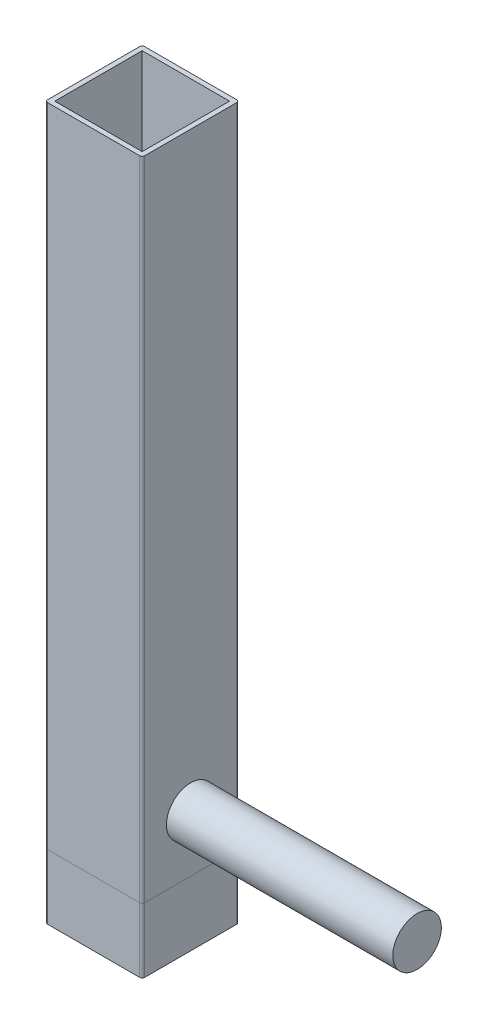
ISO-10303-21;
HEADER;
FILE_DESCRIPTION(('STEP AP214'),'2;1');
FILE_NAME('part.step','',(''),(''),'','','');
FILE_SCHEMA(('AUTOMOTIVE_DESIGN { 1 0 10303 214 1 1 1 1 }'));
ENDSEC;
DATA;
#1=APPLICATION_CONTEXT('core data for automotive mechanical design processes');
#2=APPLICATION_PROTOCOL_DEFINITION('international standard','automotive_design',2000,#1);
#3=PRODUCT_CONTEXT('',#1,'mechanical');
#4=PRODUCT('Part','Part','',(#3));
#5=PRODUCT_RELATED_PRODUCT_CATEGORY('part','',(#4));
#6=PRODUCT_DEFINITION_FORMATION('','',#4);
#7=PRODUCT_DEFINITION_CONTEXT('part definition',#1,'design');
#8=PRODUCT_DEFINITION('design','',#6,#7);
#9=PRODUCT_DEFINITION_SHAPE('','',#8);
#10=(LENGTH_UNIT() NAMED_UNIT(*) SI_UNIT(.MILLI.,.METRE.));
#11=(NAMED_UNIT(*) PLANE_ANGLE_UNIT() SI_UNIT($,.RADIAN.));
#12=(NAMED_UNIT(*) SI_UNIT($,.STERADIAN.) SOLID_ANGLE_UNIT());
#13=UNCERTAINTY_MEASURE_WITH_UNIT(LENGTH_MEASURE(1.E-05),#10,'distance_accuracy_value','');
#14=(GEOMETRIC_REPRESENTATION_CONTEXT(3) GLOBAL_UNCERTAINTY_ASSIGNED_CONTEXT((#13)) GLOBAL_UNIT_ASSIGNED_CONTEXT((#10,
#11,#12)) REPRESENTATION_CONTEXT('',''));
#15=CARTESIAN_POINT('',(0.,0.,0.));
#16=DIRECTION('',(0.,0.,1.));
#17=DIRECTION('',(1.,0.,0.));
#18=AXIS2_PLACEMENT_3D('',#15,#16,#17);
#19=CARTESIAN_POINT('',(107.95,22.225,0.));
#20=DIRECTION('',(-1.,0.,0.));
#21=DIRECTION('',(0.,0.,1.));
#22=AXIS2_PLACEMENT_3D('',#19,#20,#21);
#23=CYLINDRICAL_SURFACE('',#22,9.525);
#24=CARTESIAN_POINT('',(107.95,22.225,0.));
#25=DIRECTION('',(1.,0.,0.));
#26=DIRECTION('',(0.,0.,-1.));
#27=AXIS2_PLACEMENT_3D('',#24,#25,#26);
#28=CIRCLE('',#27,9.525);
#29=CARTESIAN_POINT('',(107.95,22.225,-9.525));
#30=VERTEX_POINT('',#29);
#31=EDGE_CURVE('E12',#30,#30,#28,.T.);
#32=ORIENTED_EDGE('',*,*,#31,.F.);
#33=EDGE_LOOP('',(#32));
#34=FACE_BOUND('',#33,.T.);
#35=CARTESIAN_POINT('',(19.05,22.225,0.));
#36=DIRECTION('',(1.,0.,0.));
#37=DIRECTION('',(0.,0.,-1.));
#38=AXIS2_PLACEMENT_3D('',#35,#36,#37);
#39=CIRCLE('',#38,9.525);
#40=CARTESIAN_POINT('',(19.05,22.225,-9.525));
#41=VERTEX_POINT('',#40);
#42=EDGE_CURVE('E74',#41,#41,#39,.T.);
#43=ORIENTED_EDGE('',*,*,#42,.T.);
#44=EDGE_LOOP('',(#43));
#45=FACE_BOUND('',#44,.T.);
#46=ADVANCED_FACE('F71',(#34,#45),#23,.T.);
#47=CARTESIAN_POINT('',(107.95,22.225,0.));
#48=DIRECTION('',(1.,0.,0.));
#49=DIRECTION('',(0.,0.,-1.));
#50=AXIS2_PLACEMENT_3D('',#47,#48,#49);
#51=PLANE('',#50);
#52=ORIENTED_EDGE('',*,*,#31,.T.);
#53=EDGE_LOOP('',(#52));
#54=FACE_BOUND('',#53,.T.);
#55=ADVANCED_FACE('F86',(#54),#51,.T.);
#56=CARTESIAN_POINT('',(19.05,22.225,0.));
#57=DIRECTION('',(1.,0.,0.));
#58=DIRECTION('',(0.,0.,-1.));
#59=AXIS2_PLACEMENT_3D('',#56,#57,#58);
#60=PLANE('',#59);
#61=ORIENTED_EDGE('',*,*,#42,.F.);
#62=EDGE_LOOP('',(#61));
#63=FACE_BOUND('',#62,.T.);
#64=ADVANCED_FACE('F84',(#63),#60,.F.);
#65=CLOSED_SHELL('',(#46,#55,#64));
#66=MANIFOLD_SOLID_BREP('B2',#65);
#67=CARTESIAN_POINT('',(19.05,0.,-18.05));
#68=DIRECTION('',(-1.,0.,0.));
#69=DIRECTION('',(0.,-1.,0.));
#70=AXIS2_PLACEMENT_3D('',#67,#68,#69);
#71=PLANE('',#70);
#72=DIRECTION('',(0.,0.,1.));
#73=VECTOR('',#72,1.);
#74=CARTESIAN_POINT('',(19.05,0.,-18.05));
#75=LINE('',#74,#73);
#76=CARTESIAN_POINT('',(19.05,0.,-18.05));
#77=VERTEX_POINT('',#76);
#78=CARTESIAN_POINT('',(19.05,0.,18.05));
#79=VERTEX_POINT('',#78);
#80=EDGE_CURVE('E219',#77,#79,#75,.T.);
#81=ORIENTED_EDGE('',*,*,#80,.F.);
#82=DIRECTION('',(0.,1.,0.));
#83=VECTOR('',#82,1.);
#84=CARTESIAN_POINT('',(19.05,0.,-18.05));
#85=LINE('',#84,#83);
#86=CARTESIAN_POINT('',(19.05,254.,-18.05));
#87=VERTEX_POINT('',#86);
#88=EDGE_CURVE('E135',#77,#87,#85,.T.);
#89=ORIENTED_EDGE('',*,*,#88,.T.);
#90=DIRECTION('',(0.,0.,1.));
#91=VECTOR('',#90,1.);
#92=CARTESIAN_POINT('',(19.05,254.,-18.05));
#93=LINE('',#92,#91);
#94=CARTESIAN_POINT('',(19.05,254.,18.05));
#95=VERTEX_POINT('',#94);
#96=EDGE_CURVE('E287',#87,#95,#93,.T.);
#97=ORIENTED_EDGE('',*,*,#96,.T.);
#98=DIRECTION('',(0.,1.,0.));
#99=VECTOR('',#98,1.);
#100=CARTESIAN_POINT('',(19.05,0.,18.05));
#101=LINE('',#100,#99);
#102=EDGE_CURVE('E237',#79,#95,#101,.T.);
#103=ORIENTED_EDGE('',*,*,#102,.F.);
#104=EDGE_LOOP('',(#81,#89,#97,#103));
#105=FACE_BOUND('',#104,.T.);
#106=ADVANCED_FACE('F120',(#105),#71,.F.);
#107=CARTESIAN_POINT('',(18.05,0.,-18.05));
#108=DIRECTION('',(0.,1.,0.));
#109=DIRECTION('',(-1.,0.,0.));
#110=AXIS2_PLACEMENT_3D('',#107,#108,#109);
#111=CYLINDRICAL_SURFACE('',#110,1.);
#112=CARTESIAN_POINT('',(18.05,0.,-18.05));
#113=DIRECTION('',(0.,-1.,0.));
#114=DIRECTION('',(1.,0.,0.));
#115=AXIS2_PLACEMENT_3D('',#112,#113,#114);
#116=CIRCLE('',#115,1.);
#117=CARTESIAN_POINT('',(18.05,0.,-19.05));
#118=VERTEX_POINT('',#117);
#119=EDGE_CURVE('E306',#118,#77,#116,.T.);
#120=ORIENTED_EDGE('',*,*,#119,.F.);
#121=DIRECTION('',(0.,1.,0.));
#122=VECTOR('',#121,1.);
#123=CARTESIAN_POINT('',(18.05,0.,-19.05));
#124=LINE('',#123,#122);
#125=CARTESIAN_POINT('',(18.05,254.,-19.05));
#126=VERTEX_POINT('',#125);
#127=EDGE_CURVE('E240',#118,#126,#124,.T.);
#128=ORIENTED_EDGE('',*,*,#127,.T.);
#129=CARTESIAN_POINT('',(18.05,254.,-18.05));
#130=DIRECTION('',(0.,-1.,0.));
#131=DIRECTION('',(1.,0.,0.));
#132=AXIS2_PLACEMENT_3D('',#129,#130,#131);
#133=CIRCLE('',#132,1.);
#134=EDGE_CURVE('E285',#126,#87,#133,.T.);
#135=ORIENTED_EDGE('',*,*,#134,.T.);
#136=ORIENTED_EDGE('',*,*,#88,.F.);
#137=EDGE_LOOP('',(#120,#128,#135,#136));
#138=FACE_BOUND('',#137,.T.);
#139=ADVANCED_FACE('F329',(#138),#111,.T.);
#140=CARTESIAN_POINT('',(-18.05,0.,-19.05));
#141=DIRECTION('',(0.,0.,1.));
#142=DIRECTION('',(1.,0.,0.));
#143=AXIS2_PLACEMENT_3D('',#140,#141,#142);
#144=PLANE('',#143);
#145=DIRECTION('',(1.,0.,0.));
#146=VECTOR('',#145,1.);
#147=CARTESIAN_POINT('',(-18.05,0.,-19.05));
#148=LINE('',#147,#146);
#149=CARTESIAN_POINT('',(-18.05,0.,-19.05));
#150=VERTEX_POINT('',#149);
#151=EDGE_CURVE('E309',#150,#118,#148,.T.);
#152=ORIENTED_EDGE('',*,*,#151,.F.);
#153=DIRECTION('',(0.,1.,0.));
#154=VECTOR('',#153,1.);
#155=CARTESIAN_POINT('',(-18.05,0.,-19.05));
#156=LINE('',#155,#154);
#157=CARTESIAN_POINT('',(-18.05,254.,-19.05));
#158=VERTEX_POINT('',#157);
#159=EDGE_CURVE('E242',#150,#158,#156,.T.);
#160=ORIENTED_EDGE('',*,*,#159,.T.);
#161=DIRECTION('',(1.,0.,0.));
#162=VECTOR('',#161,1.);
#163=CARTESIAN_POINT('',(-18.05,254.,-19.05));
#164=LINE('',#163,#162);
#165=EDGE_CURVE('E282',#158,#126,#164,.T.);
#166=ORIENTED_EDGE('',*,*,#165,.T.);
#167=ORIENTED_EDGE('',*,*,#127,.F.);
#168=EDGE_LOOP('',(#152,#160,#166,#167));
#169=FACE_BOUND('',#168,.T.);
#170=ADVANCED_FACE('F332',(#169),#144,.F.);
#171=CARTESIAN_POINT('',(-18.05,0.,-18.05));
#172=DIRECTION('',(0.,1.,0.));
#173=DIRECTION('',(-1.,0.,0.));
#174=AXIS2_PLACEMENT_3D('',#171,#172,#173);
#175=CYLINDRICAL_SURFACE('',#174,1.);
#176=CARTESIAN_POINT('',(-18.05,0.,-18.05));
#177=DIRECTION('',(0.,-1.,0.));
#178=DIRECTION('',(1.,0.,0.));
#179=AXIS2_PLACEMENT_3D('',#176,#177,#178);
#180=CIRCLE('',#179,1.);
#181=CARTESIAN_POINT('',(-19.05,0.,-18.05));
#182=VERTEX_POINT('',#181);
#183=EDGE_CURVE('E312',#182,#150,#180,.T.);
#184=ORIENTED_EDGE('',*,*,#183,.F.);
#185=DIRECTION('',(0.,1.,0.));
#186=VECTOR('',#185,1.);
#187=CARTESIAN_POINT('',(-19.05,0.,-18.05));
#188=LINE('',#187,#186);
#189=CARTESIAN_POINT('',(-19.05,254.,-18.05));
#190=VERTEX_POINT('',#189);
#191=EDGE_CURVE('E244',#182,#190,#188,.T.);
#192=ORIENTED_EDGE('',*,*,#191,.T.);
#193=CARTESIAN_POINT('',(-18.05,254.,-18.05));
#194=DIRECTION('',(0.,-1.,0.));
#195=DIRECTION('',(-1.,0.,0.));
#196=AXIS2_PLACEMENT_3D('',#193,#194,#195);
#197=CIRCLE('',#196,1.);
#198=EDGE_CURVE('E276',#190,#158,#197,.T.);
#199=ORIENTED_EDGE('',*,*,#198,.T.);
#200=ORIENTED_EDGE('',*,*,#159,.F.);
#201=EDGE_LOOP('',(#184,#192,#199,#200));
#202=FACE_BOUND('',#201,.T.);
#203=ADVANCED_FACE('F335',(#202),#175,.T.);
#204=CARTESIAN_POINT('',(-19.05,0.,-18.05));
#205=DIRECTION('',(1.,0.,0.));
#206=DIRECTION('',(0.,1.,0.));
#207=AXIS2_PLACEMENT_3D('',#204,#205,#206);
#208=PLANE('',#207);
#209=DIRECTION('',(0.,0.,-1.));
#210=VECTOR('',#209,1.);
#211=CARTESIAN_POINT('',(-19.05,0.,-18.05));
#212=LINE('',#211,#210);
#213=CARTESIAN_POINT('',(-19.05,0.,18.05));
#214=VERTEX_POINT('',#213);
#215=EDGE_CURVE('E315',#214,#182,#212,.T.);
#216=ORIENTED_EDGE('',*,*,#215,.F.);
#217=DIRECTION('',(0.,1.,0.));
#218=VECTOR('',#217,1.);
#219=CARTESIAN_POINT('',(-19.05,0.,18.05));
#220=LINE('',#219,#218);
#221=CARTESIAN_POINT('',(-19.05,254.,18.05));
#222=VERTEX_POINT('',#221);
#223=EDGE_CURVE('E246',#214,#222,#220,.T.);
#224=ORIENTED_EDGE('',*,*,#223,.T.);
#225=DIRECTION('',(0.,0.,-1.));
#226=VECTOR('',#225,1.);
#227=CARTESIAN_POINT('',(-19.05,254.,-18.05));
#228=LINE('',#227,#226);
#229=EDGE_CURVE('E274',#222,#190,#228,.T.);
#230=ORIENTED_EDGE('',*,*,#229,.T.);
#231=ORIENTED_EDGE('',*,*,#191,.F.);
#232=EDGE_LOOP('',(#216,#224,#230,#231));
#233=FACE_BOUND('',#232,.T.);
#234=ADVANCED_FACE('F338',(#233),#208,.F.);
#235=CARTESIAN_POINT('',(-18.05,0.,18.05));
#236=DIRECTION('',(0.,1.,0.));
#237=DIRECTION('',(-1.,0.,0.));
#238=AXIS2_PLACEMENT_3D('',#235,#236,#237);
#239=CYLINDRICAL_SURFACE('',#238,1.);
#240=CARTESIAN_POINT('',(-18.05,0.,18.05));
#241=DIRECTION('',(0.,-1.,0.));
#242=DIRECTION('',(1.,0.,0.));
#243=AXIS2_PLACEMENT_3D('',#240,#241,#242);
#244=CIRCLE('',#243,1.);
#245=CARTESIAN_POINT('',(-18.05,0.,19.05));
#246=VERTEX_POINT('',#245);
#247=EDGE_CURVE('E258',#246,#214,#244,.T.);
#248=ORIENTED_EDGE('',*,*,#247,.F.);
#249=DIRECTION('',(0.,1.,0.));
#250=VECTOR('',#249,1.);
#251=CARTESIAN_POINT('',(-18.05,0.,19.05));
#252=LINE('',#251,#250);
#253=CARTESIAN_POINT('',(-18.05,254.,19.05));
#254=VERTEX_POINT('',#253);
#255=EDGE_CURVE('E231',#246,#254,#252,.T.);
#256=ORIENTED_EDGE('',*,*,#255,.T.);
#257=CARTESIAN_POINT('',(-18.05,254.,18.05));
#258=DIRECTION('',(0.,-1.,0.));
#259=DIRECTION('',(-1.,0.,0.));
#260=AXIS2_PLACEMENT_3D('',#257,#258,#259);
#261=CIRCLE('',#260,1.);
#262=EDGE_CURVE('E255',#254,#222,#261,.T.);
#263=ORIENTED_EDGE('',*,*,#262,.T.);
#264=ORIENTED_EDGE('',*,*,#223,.F.);
#265=EDGE_LOOP('',(#248,#256,#263,#264));
#266=FACE_BOUND('',#265,.T.);
#267=ADVANCED_FACE('F252',(#266),#239,.T.);
#268=CARTESIAN_POINT('',(-18.05,0.,19.05));
#269=DIRECTION('',(0.,0.,-1.));
#270=DIRECTION('',(-1.,0.,0.));
#271=AXIS2_PLACEMENT_3D('',#268,#269,#270);
#272=PLANE('',#271);
#273=DIRECTION('',(-1.,0.,0.));
#274=VECTOR('',#273,1.);
#275=CARTESIAN_POINT('',(-18.05,0.,19.05));
#276=LINE('',#275,#274);
#277=CARTESIAN_POINT('',(18.05,0.,19.05));
#278=VERTEX_POINT('',#277);
#279=EDGE_CURVE('E319',#278,#246,#276,.T.);
#280=ORIENTED_EDGE('',*,*,#279,.F.);
#281=DIRECTION('',(0.,1.,0.));
#282=VECTOR('',#281,1.);
#283=CARTESIAN_POINT('',(18.05,0.,19.05));
#284=LINE('',#283,#282);
#285=CARTESIAN_POINT('',(18.05,254.,19.05));
#286=VERTEX_POINT('',#285);
#287=EDGE_CURVE('E227',#278,#286,#284,.T.);
#288=ORIENTED_EDGE('',*,*,#287,.T.);
#289=DIRECTION('',(-1.,0.,0.));
#290=VECTOR('',#289,1.);
#291=CARTESIAN_POINT('',(-18.05,254.,19.05));
#292=LINE('',#291,#290);
#293=EDGE_CURVE('E262',#286,#254,#292,.T.);
#294=ORIENTED_EDGE('',*,*,#293,.T.);
#295=ORIENTED_EDGE('',*,*,#255,.F.);
#296=EDGE_LOOP('',(#280,#288,#294,#295));
#297=FACE_BOUND('',#296,.T.);
#298=ADVANCED_FACE('F263',(#297),#272,.F.);
#299=CARTESIAN_POINT('',(18.05,0.,18.05));
#300=DIRECTION('',(0.,1.,0.));
#301=DIRECTION('',(-1.,0.,0.));
#302=AXIS2_PLACEMENT_3D('',#299,#300,#301);
#303=CYLINDRICAL_SURFACE('',#302,1.);
#304=CARTESIAN_POINT('',(18.05,0.,18.05));
#305=DIRECTION('',(0.,-1.,0.));
#306=DIRECTION('',(1.,0.,0.));
#307=AXIS2_PLACEMENT_3D('',#304,#305,#306);
#308=CIRCLE('',#307,1.);
#309=EDGE_CURVE('E321',#79,#278,#308,.T.);
#310=ORIENTED_EDGE('',*,*,#309,.F.);
#311=ORIENTED_EDGE('',*,*,#102,.T.);
#312=CARTESIAN_POINT('',(18.05,254.,18.05));
#313=DIRECTION('',(0.,-1.,0.));
#314=DIRECTION('',(-1.,0.,0.));
#315=AXIS2_PLACEMENT_3D('',#312,#313,#314);
#316=CIRCLE('',#315,1.);
#317=EDGE_CURVE('E268',#95,#286,#316,.T.);
#318=ORIENTED_EDGE('',*,*,#317,.T.);
#319=ORIENTED_EDGE('',*,*,#287,.F.);
#320=EDGE_LOOP('',(#310,#311,#318,#319));
#321=FACE_BOUND('',#320,.T.);
#322=ADVANCED_FACE('F122',(#321),#303,.T.);
#323=CARTESIAN_POINT('',(18.05,254.,18.05));
#324=DIRECTION('',(0.,1.,0.));
#325=DIRECTION('',(-1.,0.,0.));
#326=AXIS2_PLACEMENT_3D('',#323,#324,#325);
#327=PLANE('',#326);
#328=ORIENTED_EDGE('',*,*,#317,.F.);
#329=ORIENTED_EDGE('',*,*,#96,.F.);
#330=ORIENTED_EDGE('',*,*,#134,.F.);
#331=ORIENTED_EDGE('',*,*,#165,.F.);
#332=ORIENTED_EDGE('',*,*,#198,.F.);
#333=ORIENTED_EDGE('',*,*,#229,.F.);
#334=ORIENTED_EDGE('',*,*,#262,.F.);
#335=ORIENTED_EDGE('',*,*,#293,.F.);
#336=EDGE_LOOP('',(#328,#329,#330,#331,#332,#333,#334,#335));
#337=FACE_BOUND('',#336,.T.);
#338=DIRECTION('',(1.,0.,0.));
#339=VECTOR('',#338,1.);
#340=CARTESIAN_POINT('',(-17.16,254.,-17.16));
#341=LINE('',#340,#339);
#342=CARTESIAN_POINT('',(-17.16,254.,-17.16));
#343=VERTEX_POINT('',#342);
#344=CARTESIAN_POINT('',(17.16,254.,-17.16));
#345=VERTEX_POINT('',#344);
#346=EDGE_CURVE('E290',#343,#345,#341,.T.);
#347=ORIENTED_EDGE('',*,*,#346,.T.);
#348=DIRECTION('',(0.,0.,1.));
#349=VECTOR('',#348,1.);
#350=CARTESIAN_POINT('',(17.16,254.,-17.16));
#351=LINE('',#350,#349);
#352=CARTESIAN_POINT('',(17.16,254.,17.16));
#353=VERTEX_POINT('',#352);
#354=EDGE_CURVE('E225',#345,#353,#351,.T.);
#355=ORIENTED_EDGE('',*,*,#354,.T.);
#356=DIRECTION('',(-1.,0.,0.));
#357=VECTOR('',#356,1.);
#358=CARTESIAN_POINT('',(-17.16,254.,17.16));
#359=LINE('',#358,#357);
#360=CARTESIAN_POINT('',(-17.16,254.,17.16));
#361=VERTEX_POINT('',#360);
#362=EDGE_CURVE('E294',#353,#361,#359,.T.);
#363=ORIENTED_EDGE('',*,*,#362,.T.);
#364=DIRECTION('',(0.,0.,-1.));
#365=VECTOR('',#364,1.);
#366=CARTESIAN_POINT('',(-17.16,254.,-17.16));
#367=LINE('',#366,#365);
#368=EDGE_CURVE('E292',#361,#343,#367,.T.);
#369=ORIENTED_EDGE('',*,*,#368,.T.);
#370=EDGE_LOOP('',(#347,#355,#363,#369));
#371=FACE_BOUND('',#370,.T.);
#372=ADVANCED_FACE('F270',(#337,#371),#327,.T.);
#373=CARTESIAN_POINT('',(17.16,0.,-17.16));
#374=DIRECTION('',(-1.,0.,0.));
#375=DIRECTION('',(0.,-1.,0.));
#376=AXIS2_PLACEMENT_3D('',#373,#374,#375);
#377=PLANE('',#376);
#378=DIRECTION('',(0.,1.,0.));
#379=VECTOR('',#378,1.);
#380=CARTESIAN_POINT('',(17.16,0.,-17.16));
#381=LINE('',#380,#379);
#382=CARTESIAN_POINT('',(17.16,0.,-17.16));
#383=VERTEX_POINT('',#382);
#384=EDGE_CURVE('E216',#383,#345,#381,.T.);
#385=ORIENTED_EDGE('',*,*,#384,.F.);
#386=DIRECTION('',(0.,0.,1.));
#387=VECTOR('',#386,1.);
#388=CARTESIAN_POINT('',(17.16,0.,-17.16));
#389=LINE('',#388,#387);
#390=CARTESIAN_POINT('',(17.16,0.,17.16));
#391=VERTEX_POINT('',#390);
#392=EDGE_CURVE('E69',#383,#391,#389,.T.);
#393=ORIENTED_EDGE('',*,*,#392,.T.);
#394=DIRECTION('',(0.,1.,0.));
#395=VECTOR('',#394,1.);
#396=CARTESIAN_POINT('',(17.16,0.,17.16));
#397=LINE('',#396,#395);
#398=EDGE_CURVE('E226',#391,#353,#397,.T.);
#399=ORIENTED_EDGE('',*,*,#398,.T.);
#400=ORIENTED_EDGE('',*,*,#354,.F.);
#401=EDGE_LOOP('',(#385,#393,#399,#400));
#402=FACE_BOUND('',#401,.T.);
#403=ADVANCED_FACE('F223',(#402),#377,.T.);
#404=CARTESIAN_POINT('',(-17.16,0.,17.16));
#405=DIRECTION('',(0.,0.,-1.));
#406=DIRECTION('',(-1.,0.,0.));
#407=AXIS2_PLACEMENT_3D('',#404,#405,#406);
#408=PLANE('',#407);
#409=ORIENTED_EDGE('',*,*,#398,.F.);
#410=DIRECTION('',(-1.,0.,0.));
#411=VECTOR('',#410,1.);
#412=CARTESIAN_POINT('',(-17.16,0.,17.16));
#413=LINE('',#412,#411);
#414=CARTESIAN_POINT('',(-17.16,0.,17.16));
#415=VERTEX_POINT('',#414);
#416=EDGE_CURVE('E143',#391,#415,#413,.T.);
#417=ORIENTED_EDGE('',*,*,#416,.T.);
#418=DIRECTION('',(0.,1.,0.));
#419=VECTOR('',#418,1.);
#420=CARTESIAN_POINT('',(-17.16,0.,17.16));
#421=LINE('',#420,#419);
#422=EDGE_CURVE('E229',#415,#361,#421,.T.);
#423=ORIENTED_EDGE('',*,*,#422,.T.);
#424=ORIENTED_EDGE('',*,*,#362,.F.);
#425=EDGE_LOOP('',(#409,#417,#423,#424));
#426=FACE_BOUND('',#425,.T.);
#427=ADVANCED_FACE('F371',(#426),#408,.T.);
#428=CARTESIAN_POINT('',(-17.16,0.,-17.16));
#429=DIRECTION('',(1.,0.,0.));
#430=DIRECTION('',(0.,1.,0.));
#431=AXIS2_PLACEMENT_3D('',#428,#429,#430);
#432=PLANE('',#431);
#433=ORIENTED_EDGE('',*,*,#422,.F.);
#434=DIRECTION('',(0.,0.,-1.));
#435=VECTOR('',#434,1.);
#436=CARTESIAN_POINT('',(-17.16,0.,-17.16));
#437=LINE('',#436,#435);
#438=CARTESIAN_POINT('',(-17.16,0.,-17.16));
#439=VERTEX_POINT('',#438);
#440=EDGE_CURVE('E220',#415,#439,#437,.T.);
#441=ORIENTED_EDGE('',*,*,#440,.T.);
#442=DIRECTION('',(0.,1.,0.));
#443=VECTOR('',#442,1.);
#444=CARTESIAN_POINT('',(-17.16,0.,-17.16));
#445=LINE('',#444,#443);
#446=EDGE_CURVE('E128',#439,#343,#445,.T.);
#447=ORIENTED_EDGE('',*,*,#446,.T.);
#448=ORIENTED_EDGE('',*,*,#368,.F.);
#449=EDGE_LOOP('',(#433,#441,#447,#448));
#450=FACE_BOUND('',#449,.T.);
#451=ADVANCED_FACE('F300',(#450),#432,.T.);
#452=CARTESIAN_POINT('',(-17.16,0.,-17.16));
#453=DIRECTION('',(0.,0.,1.));
#454=DIRECTION('',(1.,0.,0.));
#455=AXIS2_PLACEMENT_3D('',#452,#453,#454);
#456=PLANE('',#455);
#457=ORIENTED_EDGE('',*,*,#446,.F.);
#458=DIRECTION('',(1.,0.,0.));
#459=VECTOR('',#458,1.);
#460=CARTESIAN_POINT('',(-17.16,0.,-17.16));
#461=LINE('',#460,#459);
#462=EDGE_CURVE('E209',#439,#383,#461,.T.);
#463=ORIENTED_EDGE('',*,*,#462,.T.);
#464=ORIENTED_EDGE('',*,*,#384,.T.);
#465=ORIENTED_EDGE('',*,*,#346,.F.);
#466=EDGE_LOOP('',(#457,#463,#464,#465));
#467=FACE_BOUND('',#466,.T.);
#468=ADVANCED_FACE('F214',(#467),#456,.T.);
#469=CARTESIAN_POINT('',(0.,0.,0.));
#470=DIRECTION('',(0.,-1.,0.));
#471=DIRECTION('',(1.,0.,0.));
#472=AXIS2_PLACEMENT_3D('',#469,#470,#471);
#473=PLANE('',#472);
#474=ORIENTED_EDGE('',*,*,#462,.F.);
#475=ORIENTED_EDGE('',*,*,#440,.F.);
#476=ORIENTED_EDGE('',*,*,#416,.F.);
#477=ORIENTED_EDGE('',*,*,#392,.F.);
#478=EDGE_LOOP('',(#474,#475,#476,#477));
#479=FACE_BOUND('',#478,.T.);
#480=ORIENTED_EDGE('',*,*,#80,.T.);
#481=ORIENTED_EDGE('',*,*,#309,.T.);
#482=ORIENTED_EDGE('',*,*,#279,.T.);
#483=ORIENTED_EDGE('',*,*,#247,.T.);
#484=ORIENTED_EDGE('',*,*,#215,.T.);
#485=ORIENTED_EDGE('',*,*,#183,.T.);
#486=ORIENTED_EDGE('',*,*,#151,.T.);
#487=ORIENTED_EDGE('',*,*,#119,.T.);
#488=EDGE_LOOP('',(#480,#481,#482,#483,#484,#485,#486,#487));
#489=FACE_BOUND('',#488,.T.);
#490=ADVANCED_FACE('F207',(#479,#489),#473,.T.);
#491=CLOSED_SHELL('',(#106,#139,#170,#203,#234,#267,#298,#322,#372,#403,#427,#451,#468,#490));
#492=MANIFOLD_SOLID_BREP('B7',#491);
#493=CARTESIAN_POINT('',(19.05,-25.4,-18.05));
#494=DIRECTION('',(-1.,0.,0.));
#495=DIRECTION('',(0.,-1.,0.));
#496=AXIS2_PLACEMENT_3D('',#493,#494,#495);
#497=PLANE('',#496);
#498=DIRECTION('',(0.,0.,-1.));
#499=VECTOR('',#498,1.);
#500=CARTESIAN_POINT('',(19.05,0.,-18.05));
#501=LINE('',#500,#499);
#502=CARTESIAN_POINT('',(19.05,0.,18.05));
#503=VERTEX_POINT('',#502);
#504=CARTESIAN_POINT('',(19.05,0.,-18.05));
#505=VERTEX_POINT('',#504);
#506=EDGE_CURVE('E679',#503,#505,#501,.T.);
#507=ORIENTED_EDGE('',*,*,#506,.F.);
#508=DIRECTION('',(0.,1.,0.));
#509=VECTOR('',#508,1.);
#510=CARTESIAN_POINT('',(19.05,-25.4,18.05));
#511=LINE('',#510,#509);
#512=CARTESIAN_POINT('',(19.05,-25.4,18.05));
#513=VERTEX_POINT('',#512);
#514=EDGE_CURVE('E511',#513,#503,#511,.T.);
#515=ORIENTED_EDGE('',*,*,#514,.F.);
#516=DIRECTION('',(0.,0.,1.));
#517=VECTOR('',#516,1.);
#518=CARTESIAN_POINT('',(19.05,-25.4,-18.05));
#519=LINE('',#518,#517);
#520=CARTESIAN_POINT('',(19.05,-25.4,-18.05));
#521=VERTEX_POINT('',#520);
#522=EDGE_CURVE('E663',#521,#513,#519,.T.);
#523=ORIENTED_EDGE('',*,*,#522,.F.);
#524=DIRECTION('',(0.,1.,0.));
#525=VECTOR('',#524,1.);
#526=CARTESIAN_POINT('',(19.05,-25.4,-18.05));
#527=LINE('',#526,#525);
#528=EDGE_CURVE('E613',#521,#505,#527,.T.);
#529=ORIENTED_EDGE('',*,*,#528,.T.);
#530=EDGE_LOOP('',(#507,#515,#523,#529));
#531=FACE_BOUND('',#530,.T.);
#532=ADVANCED_FACE('F496',(#531),#497,.F.);
#533=CARTESIAN_POINT('',(18.05,-25.4,-18.05));
#534=DIRECTION('',(0.,1.,0.));
#535=DIRECTION('',(-1.,0.,0.));
#536=AXIS2_PLACEMENT_3D('',#533,#534,#535);
#537=CYLINDRICAL_SURFACE('',#536,1.);
#538=CARTESIAN_POINT('',(18.05,0.,-18.05));
#539=DIRECTION('',(0.,1.,0.));
#540=DIRECTION('',(-1.,0.,0.));
#541=AXIS2_PLACEMENT_3D('',#538,#539,#540);
#542=CIRCLE('',#541,1.);
#543=CARTESIAN_POINT('',(18.05,0.,-19.05));
#544=VERTEX_POINT('',#543);
#545=EDGE_CURVE('E683',#505,#544,#542,.T.);
#546=ORIENTED_EDGE('',*,*,#545,.F.);
#547=ORIENTED_EDGE('',*,*,#528,.F.);
#548=CARTESIAN_POINT('',(18.05,-25.4,-18.05));
#549=DIRECTION('',(0.,-1.,0.));
#550=DIRECTION('',(1.,0.,0.));
#551=AXIS2_PLACEMENT_3D('',#548,#549,#550);
#552=CIRCLE('',#551,1.);
#553=CARTESIAN_POINT('',(18.05,-25.4,-19.05));
#554=VERTEX_POINT('',#553);
#555=EDGE_CURVE('E661',#554,#521,#552,.T.);
#556=ORIENTED_EDGE('',*,*,#555,.F.);
#557=DIRECTION('',(0.,1.,0.));
#558=VECTOR('',#557,1.);
#559=CARTESIAN_POINT('',(18.05,-25.4,-19.05));
#560=LINE('',#559,#558);
#561=EDGE_CURVE('E615',#554,#544,#560,.T.);
#562=ORIENTED_EDGE('',*,*,#561,.T.);
#563=EDGE_LOOP('',(#546,#547,#556,#562));
#564=FACE_BOUND('',#563,.T.);
#565=ADVANCED_FACE('F714',(#564),#537,.T.);
#566=CARTESIAN_POINT('',(-18.05,-25.4,-19.05));
#567=DIRECTION('',(0.,0.,1.));
#568=DIRECTION('',(1.,0.,0.));
#569=AXIS2_PLACEMENT_3D('',#566,#567,#568);
#570=PLANE('',#569);
#571=DIRECTION('',(-1.,0.,0.));
#572=VECTOR('',#571,1.);
#573=CARTESIAN_POINT('',(-18.05,0.,-19.05));
#574=LINE('',#573,#572);
#575=CARTESIAN_POINT('',(-18.05,0.,-19.05));
#576=VERTEX_POINT('',#575);
#577=EDGE_CURVE('E686',#544,#576,#574,.T.);
#578=ORIENTED_EDGE('',*,*,#577,.F.);
#579=ORIENTED_EDGE('',*,*,#561,.F.);
#580=DIRECTION('',(1.,0.,0.));
#581=VECTOR('',#580,1.);
#582=CARTESIAN_POINT('',(-18.05,-25.4,-19.05));
#583=LINE('',#582,#581);
#584=CARTESIAN_POINT('',(-18.05,-25.4,-19.05));
#585=VERTEX_POINT('',#584);
#586=EDGE_CURVE('E659',#585,#554,#583,.T.);
#587=ORIENTED_EDGE('',*,*,#586,.F.);
#588=DIRECTION('',(0.,1.,0.));
#589=VECTOR('',#588,1.);
#590=CARTESIAN_POINT('',(-18.05,-25.4,-19.05));
#591=LINE('',#590,#589);
#592=EDGE_CURVE('E618',#585,#576,#591,.T.);
#593=ORIENTED_EDGE('',*,*,#592,.T.);
#594=EDGE_LOOP('',(#578,#579,#587,#593));
#595=FACE_BOUND('',#594,.T.);
#596=ADVANCED_FACE('F720',(#595),#570,.F.);
#597=CARTESIAN_POINT('',(-18.05,-25.4,-18.05));
#598=DIRECTION('',(0.,1.,0.));
#599=DIRECTION('',(-1.,0.,0.));
#600=AXIS2_PLACEMENT_3D('',#597,#598,#599);
#601=CYLINDRICAL_SURFACE('',#600,1.);
#602=CARTESIAN_POINT('',(-18.05,0.,-18.05));
#603=DIRECTION('',(0.,1.,0.));
#604=DIRECTION('',(-1.,0.,0.));
#605=AXIS2_PLACEMENT_3D('',#602,#603,#604);
#606=CIRCLE('',#605,1.);
#607=CARTESIAN_POINT('',(-19.05,0.,-18.05));
#608=VERTEX_POINT('',#607);
#609=EDGE_CURVE('E689',#576,#608,#606,.T.);
#610=ORIENTED_EDGE('',*,*,#609,.F.);
#611=ORIENTED_EDGE('',*,*,#592,.F.);
#612=CARTESIAN_POINT('',(-18.05,-25.4,-18.05));
#613=DIRECTION('',(0.,-1.,0.));
#614=DIRECTION('',(-1.,0.,0.));
#615=AXIS2_PLACEMENT_3D('',#612,#613,#614);
#616=CIRCLE('',#615,1.);
#617=CARTESIAN_POINT('',(-19.05,-25.4,-18.05));
#618=VERTEX_POINT('',#617);
#619=EDGE_CURVE('E657',#618,#585,#616,.T.);
#620=ORIENTED_EDGE('',*,*,#619,.F.);
#621=DIRECTION('',(0.,1.,0.));
#622=VECTOR('',#621,1.);
#623=CARTESIAN_POINT('',(-19.05,-25.4,-18.05));
#624=LINE('',#623,#622);
#625=EDGE_CURVE('E621',#618,#608,#624,.T.);
#626=ORIENTED_EDGE('',*,*,#625,.T.);
#627=EDGE_LOOP('',(#610,#611,#620,#626));
#628=FACE_BOUND('',#627,.T.);
#629=ADVANCED_FACE('F698',(#628),#601,.T.);
#630=CARTESIAN_POINT('',(-19.05,-25.4,-18.05));
#631=DIRECTION('',(1.,0.,0.));
#632=DIRECTION('',(0.,1.,0.));
#633=AXIS2_PLACEMENT_3D('',#630,#631,#632);
#634=PLANE('',#633);
#635=DIRECTION('',(0.,0.,1.));
#636=VECTOR('',#635,1.);
#637=CARTESIAN_POINT('',(-19.05,0.,-18.05));
#638=LINE('',#637,#636);
#639=CARTESIAN_POINT('',(-19.05,0.,18.05));
#640=VERTEX_POINT('',#639);
#641=EDGE_CURVE('E647',#608,#640,#638,.T.);
#642=ORIENTED_EDGE('',*,*,#641,.F.);
#643=ORIENTED_EDGE('',*,*,#625,.F.);
#644=DIRECTION('',(0.,0.,-1.));
#645=VECTOR('',#644,1.);
#646=CARTESIAN_POINT('',(-19.05,-25.4,-18.05));
#647=LINE('',#646,#645);
#648=CARTESIAN_POINT('',(-19.05,-25.4,18.05));
#649=VERTEX_POINT('',#648);
#650=EDGE_CURVE('E655',#649,#618,#647,.T.);
#651=ORIENTED_EDGE('',*,*,#650,.F.);
#652=DIRECTION('',(0.,1.,0.));
#653=VECTOR('',#652,1.);
#654=CARTESIAN_POINT('',(-19.05,-25.4,18.05));
#655=LINE('',#654,#653);
#656=EDGE_CURVE('E624',#649,#640,#655,.T.);
#657=ORIENTED_EDGE('',*,*,#656,.T.);
#658=EDGE_LOOP('',(#642,#643,#651,#657));
#659=FACE_BOUND('',#658,.T.);
#660=ADVANCED_FACE('F693',(#659),#634,.F.);
#661=CARTESIAN_POINT('',(-18.05,-25.4,18.05));
#662=DIRECTION('',(0.,1.,0.));
#663=DIRECTION('',(-1.,0.,0.));
#664=AXIS2_PLACEMENT_3D('',#661,#662,#663);
#665=CYLINDRICAL_SURFACE('',#664,1.);
#666=CARTESIAN_POINT('',(-18.05,0.,18.05));
#667=DIRECTION('',(0.,1.,0.));
#668=DIRECTION('',(-1.,0.,0.));
#669=AXIS2_PLACEMENT_3D('',#666,#667,#668);
#670=CIRCLE('',#669,1.);
#671=CARTESIAN_POINT('',(-18.05,0.,19.05));
#672=VERTEX_POINT('',#671);
#673=EDGE_CURVE('E643',#640,#672,#670,.T.);
#674=ORIENTED_EDGE('',*,*,#673,.F.);
#675=ORIENTED_EDGE('',*,*,#656,.F.);
#676=CARTESIAN_POINT('',(-18.05,-25.4,18.05));
#677=DIRECTION('',(0.,-1.,0.));
#678=DIRECTION('',(-1.,0.,0.));
#679=AXIS2_PLACEMENT_3D('',#676,#677,#678);
#680=CIRCLE('',#679,1.);
#681=CARTESIAN_POINT('',(-18.05,-25.4,19.05));
#682=VERTEX_POINT('',#681);
#683=EDGE_CURVE('E653',#682,#649,#680,.T.);
#684=ORIENTED_EDGE('',*,*,#683,.F.);
#685=DIRECTION('',(0.,1.,0.));
#686=VECTOR('',#685,1.);
#687=CARTESIAN_POINT('',(-18.05,-25.4,19.05));
#688=LINE('',#687,#686);
#689=EDGE_CURVE('E627',#682,#672,#688,.T.);
#690=ORIENTED_EDGE('',*,*,#689,.T.);
#691=EDGE_LOOP('',(#674,#675,#684,#690));
#692=FACE_BOUND('',#691,.T.);
#693=ADVANCED_FACE('F705',(#692),#665,.T.);
#694=CARTESIAN_POINT('',(-18.05,-25.4,19.05));
#695=DIRECTION('',(0.,0.,-1.));
#696=DIRECTION('',(-1.,0.,0.));
#697=AXIS2_PLACEMENT_3D('',#694,#695,#696);
#698=PLANE('',#697);
#699=DIRECTION('',(1.,0.,0.));
#700=VECTOR('',#699,1.);
#701=CARTESIAN_POINT('',(-18.05,0.,19.05));
#702=LINE('',#701,#700);
#703=CARTESIAN_POINT('',(18.05,0.,19.05));
#704=VERTEX_POINT('',#703);
#705=EDGE_CURVE('E635',#672,#704,#702,.T.);
#706=ORIENTED_EDGE('',*,*,#705,.F.);
#707=ORIENTED_EDGE('',*,*,#689,.F.);
#708=DIRECTION('',(-1.,0.,0.));
#709=VECTOR('',#708,1.);
#710=CARTESIAN_POINT('',(-18.05,-25.4,19.05));
#711=LINE('',#710,#709);
#712=CARTESIAN_POINT('',(18.05,-25.4,19.05));
#713=VERTEX_POINT('',#712);
#714=EDGE_CURVE('E636',#713,#682,#711,.T.);
#715=ORIENTED_EDGE('',*,*,#714,.F.);
#716=DIRECTION('',(0.,1.,0.));
#717=VECTOR('',#716,1.);
#718=CARTESIAN_POINT('',(18.05,-25.4,19.05));
#719=LINE('',#718,#717);
#720=EDGE_CURVE('E606',#713,#704,#719,.T.);
#721=ORIENTED_EDGE('',*,*,#720,.T.);
#722=EDGE_LOOP('',(#706,#707,#715,#721));
#723=FACE_BOUND('',#722,.T.);
#724=ADVANCED_FACE('F633',(#723),#698,.F.);
#725=CARTESIAN_POINT('',(18.05,-25.4,18.05));
#726=DIRECTION('',(0.,1.,0.));
#727=DIRECTION('',(-1.,0.,0.));
#728=AXIS2_PLACEMENT_3D('',#725,#726,#727);
#729=CYLINDRICAL_SURFACE('',#728,1.);
#730=CARTESIAN_POINT('',(18.05,0.,18.05));
#731=DIRECTION('',(0.,1.,0.));
#732=DIRECTION('',(-1.,0.,0.));
#733=AXIS2_PLACEMENT_3D('',#730,#731,#732);
#734=CIRCLE('',#733,1.);
#735=EDGE_CURVE('E641',#704,#503,#734,.T.);
#736=ORIENTED_EDGE('',*,*,#735,.F.);
#737=ORIENTED_EDGE('',*,*,#720,.F.);
#738=CARTESIAN_POINT('',(18.05,-25.4,18.05));
#739=DIRECTION('',(0.,-1.,0.));
#740=DIRECTION('',(-1.,0.,0.));
#741=AXIS2_PLACEMENT_3D('',#738,#739,#740);
#742=CIRCLE('',#741,1.);
#743=EDGE_CURVE('E645',#513,#713,#742,.T.);
#744=ORIENTED_EDGE('',*,*,#743,.F.);
#745=ORIENTED_EDGE('',*,*,#514,.T.);
#746=EDGE_LOOP('',(#736,#737,#744,#745));
#747=FACE_BOUND('',#746,.T.);
#748=ADVANCED_FACE('F498',(#747),#729,.T.);
#749=CARTESIAN_POINT('',(18.05,-25.4,18.05));
#750=DIRECTION('',(0.,1.,0.));
#751=DIRECTION('',(-1.,0.,0.));
#752=AXIS2_PLACEMENT_3D('',#749,#750,#751);
#753=PLANE('',#752);
#754=ORIENTED_EDGE('',*,*,#743,.T.);
#755=ORIENTED_EDGE('',*,*,#714,.T.);
#756=ORIENTED_EDGE('',*,*,#683,.T.);
#757=ORIENTED_EDGE('',*,*,#650,.T.);
#758=ORIENTED_EDGE('',*,*,#619,.T.);
#759=ORIENTED_EDGE('',*,*,#586,.T.);
#760=ORIENTED_EDGE('',*,*,#555,.T.);
#761=ORIENTED_EDGE('',*,*,#522,.T.);
#762=EDGE_LOOP('',(#754,#755,#756,#757,#758,#759,#760,#761));
#763=FACE_BOUND('',#762,.T.);
#764=DIRECTION('',(1.,0.,0.));
#765=VECTOR('',#764,1.);
#766=CARTESIAN_POINT('',(-17.16,-25.4,-17.16));
#767=LINE('',#766,#765);
#768=CARTESIAN_POINT('',(-17.16,-25.4,-17.16));
#769=VERTEX_POINT('',#768);
#770=CARTESIAN_POINT('',(17.16,-25.4,-17.16));
#771=VERTEX_POINT('',#770);
#772=EDGE_CURVE('E665',#769,#771,#767,.T.);
#773=ORIENTED_EDGE('',*,*,#772,.F.);
#774=DIRECTION('',(0.,0.,-1.));
#775=VECTOR('',#774,1.);
#776=CARTESIAN_POINT('',(-17.16,-25.4,-17.16));
#777=LINE('',#776,#775);
#778=CARTESIAN_POINT('',(-17.16,-25.4,17.16));
#779=VERTEX_POINT('',#778);
#780=EDGE_CURVE('E668',#779,#769,#777,.T.);
#781=ORIENTED_EDGE('',*,*,#780,.F.);
#782=DIRECTION('',(-1.,0.,0.));
#783=VECTOR('',#782,1.);
#784=CARTESIAN_POINT('',(-17.16,-25.4,17.16));
#785=LINE('',#784,#783);
#786=CARTESIAN_POINT('',(17.16,-25.4,17.16));
#787=VERTEX_POINT('',#786);
#788=EDGE_CURVE('E671',#787,#779,#785,.T.);
#789=ORIENTED_EDGE('',*,*,#788,.F.);
#790=DIRECTION('',(0.,0.,1.));
#791=VECTOR('',#790,1.);
#792=CARTESIAN_POINT('',(17.16,-25.4,-17.16));
#793=LINE('',#792,#791);
#794=EDGE_CURVE('E602',#771,#787,#793,.T.);
#795=ORIENTED_EDGE('',*,*,#794,.F.);
#796=EDGE_LOOP('',(#773,#781,#789,#795));
#797=FACE_BOUND('',#796,.T.);
#798=ADVANCED_FACE('F675',(#763,#797),#753,.F.);
#799=CARTESIAN_POINT('',(17.16,-25.4,-17.16));
#800=DIRECTION('',(-1.,0.,0.));
#801=DIRECTION('',(0.,-1.,0.));
#802=AXIS2_PLACEMENT_3D('',#799,#800,#801);
#803=PLANE('',#802);
#804=DIRECTION('',(0.,1.,0.));
#805=VECTOR('',#804,1.);
#806=CARTESIAN_POINT('',(17.16,-25.4,17.16));
#807=LINE('',#806,#805);
#808=CARTESIAN_POINT('',(17.16,0.,17.16));
#809=VERTEX_POINT('',#808);
#810=EDGE_CURVE('E593',#787,#809,#807,.T.);
#811=ORIENTED_EDGE('',*,*,#810,.T.);
#812=DIRECTION('',(0.,0.,-1.));
#813=VECTOR('',#812,1.);
#814=CARTESIAN_POINT('',(17.16,0.,-17.16));
#815=LINE('',#814,#813);
#816=CARTESIAN_POINT('',(17.16,0.,-17.16));
#817=VERTEX_POINT('',#816);
#818=EDGE_CURVE('E118',#809,#817,#815,.T.);
#819=ORIENTED_EDGE('',*,*,#818,.T.);
#820=DIRECTION('',(0.,1.,0.));
#821=VECTOR('',#820,1.);
#822=CARTESIAN_POINT('',(17.16,-25.4,-17.16));
#823=LINE('',#822,#821);
#824=EDGE_CURVE('E603',#771,#817,#823,.T.);
#825=ORIENTED_EDGE('',*,*,#824,.F.);
#826=ORIENTED_EDGE('',*,*,#794,.T.);
#827=EDGE_LOOP('',(#811,#819,#825,#826));
#828=FACE_BOUND('',#827,.T.);
#829=ADVANCED_FACE('F600',(#828),#803,.T.);
#830=CARTESIAN_POINT('',(-17.16,-25.4,17.16));
#831=DIRECTION('',(0.,0.,-1.));
#832=DIRECTION('',(-1.,0.,0.));
#833=AXIS2_PLACEMENT_3D('',#830,#831,#832);
#834=PLANE('',#833);
#835=DIRECTION('',(0.,1.,0.));
#836=VECTOR('',#835,1.);
#837=CARTESIAN_POINT('',(-17.16,-25.4,17.16));
#838=LINE('',#837,#836);
#839=CARTESIAN_POINT('',(-17.16,0.,17.16));
#840=VERTEX_POINT('',#839);
#841=EDGE_CURVE('E595',#779,#840,#838,.T.);
#842=ORIENTED_EDGE('',*,*,#841,.T.);
#843=DIRECTION('',(1.,0.,0.));
#844=VECTOR('',#843,1.);
#845=CARTESIAN_POINT('',(-17.16,0.,17.16));
#846=LINE('',#845,#844);
#847=EDGE_CURVE('E586',#840,#809,#846,.T.);
#848=ORIENTED_EDGE('',*,*,#847,.T.);
#849=ORIENTED_EDGE('',*,*,#810,.F.);
#850=ORIENTED_EDGE('',*,*,#788,.T.);
#851=EDGE_LOOP('',(#842,#848,#849,#850));
#852=FACE_BOUND('',#851,.T.);
#853=ADVANCED_FACE('F591',(#852),#834,.T.);
#854=CARTESIAN_POINT('',(-17.16,-25.4,-17.16));
#855=DIRECTION('',(1.,0.,0.));
#856=DIRECTION('',(0.,1.,0.));
#857=AXIS2_PLACEMENT_3D('',#854,#855,#856);
#858=PLANE('',#857);
#859=DIRECTION('',(0.,1.,0.));
#860=VECTOR('',#859,1.);
#861=CARTESIAN_POINT('',(-17.16,-25.4,-17.16));
#862=LINE('',#861,#860);
#863=CARTESIAN_POINT('',(-17.16,0.,-17.16));
#864=VERTEX_POINT('',#863);
#865=EDGE_CURVE('E504',#769,#864,#862,.T.);
#866=ORIENTED_EDGE('',*,*,#865,.T.);
#867=DIRECTION('',(0.,0.,1.));
#868=VECTOR('',#867,1.);
#869=CARTESIAN_POINT('',(-17.16,0.,-17.16));
#870=LINE('',#869,#868);
#871=EDGE_CURVE('E597',#864,#840,#870,.T.);
#872=ORIENTED_EDGE('',*,*,#871,.T.);
#873=ORIENTED_EDGE('',*,*,#841,.F.);
#874=ORIENTED_EDGE('',*,*,#780,.T.);
#875=EDGE_LOOP('',(#866,#872,#873,#874));
#876=FACE_BOUND('',#875,.T.);
#877=ADVANCED_FACE('F677',(#876),#858,.T.);
#878=CARTESIAN_POINT('',(-17.16,-25.4,-17.16));
#879=DIRECTION('',(0.,0.,1.));
#880=DIRECTION('',(1.,0.,0.));
#881=AXIS2_PLACEMENT_3D('',#878,#879,#880);
#882=PLANE('',#881);
#883=ORIENTED_EDGE('',*,*,#824,.T.);
#884=DIRECTION('',(-1.,0.,0.));
#885=VECTOR('',#884,1.);
#886=CARTESIAN_POINT('',(-17.16,0.,-17.16));
#887=LINE('',#886,#885);
#888=EDGE_CURVE('E519',#817,#864,#887,.T.);
#889=ORIENTED_EDGE('',*,*,#888,.T.);
#890=ORIENTED_EDGE('',*,*,#865,.F.);
#891=ORIENTED_EDGE('',*,*,#772,.T.);
#892=EDGE_LOOP('',(#883,#889,#890,#891));
#893=FACE_BOUND('',#892,.T.);
#894=ADVANCED_FACE('F724',(#893),#882,.T.);
#895=CARTESIAN_POINT('',(0.,0.,0.));
#896=DIRECTION('',(0.,1.,0.));
#897=DIRECTION('',(-1.,0.,0.));
#898=AXIS2_PLACEMENT_3D('',#895,#896,#897);
#899=PLANE('',#898);
#900=ORIENTED_EDGE('',*,*,#888,.F.);
#901=ORIENTED_EDGE('',*,*,#818,.F.);
#902=ORIENTED_EDGE('',*,*,#847,.F.);
#903=ORIENTED_EDGE('',*,*,#871,.F.);
#904=EDGE_LOOP('',(#900,#901,#902,#903));
#905=FACE_BOUND('',#904,.T.);
#906=ORIENTED_EDGE('',*,*,#705,.T.);
#907=ORIENTED_EDGE('',*,*,#735,.T.);
#908=ORIENTED_EDGE('',*,*,#506,.T.);
#909=ORIENTED_EDGE('',*,*,#545,.T.);
#910=ORIENTED_EDGE('',*,*,#577,.T.);
#911=ORIENTED_EDGE('',*,*,#609,.T.);
#912=ORIENTED_EDGE('',*,*,#641,.T.);
#913=ORIENTED_EDGE('',*,*,#673,.T.);
#914=EDGE_LOOP('',(#906,#907,#908,#909,#910,#911,#912,#913));
#915=FACE_BOUND('',#914,.T.);
#916=ADVANCED_FACE('F584',(#905,#915),#899,.T.);
#917=CLOSED_SHELL('',(#532,#565,#596,#629,#660,#693,#724,#748,#798,#829,#853,#877,#894,#916));
#918=MANIFOLD_SOLID_BREP('B63_NOT_SHOWN',#917);
#919=ADVANCED_BREP_SHAPE_REPRESENTATION('',(#18,#66,#492,#918),#14);
#920=SHAPE_DEFINITION_REPRESENTATION(#9,#919);
ENDSEC;
END-ISO-10303-21;
